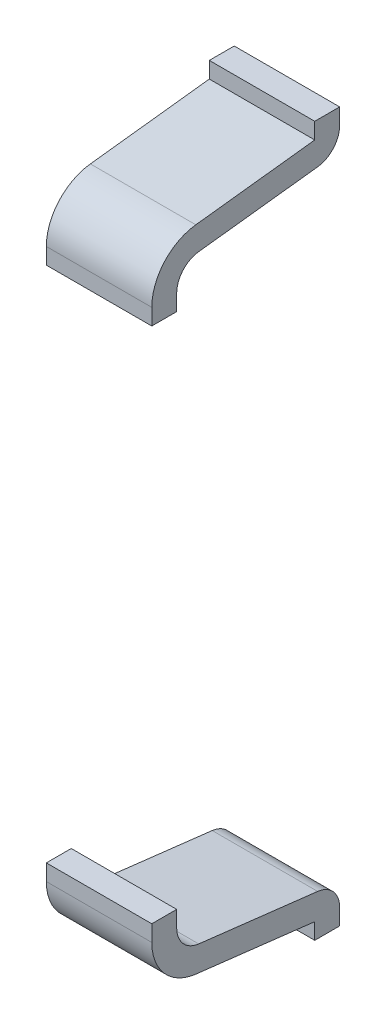
ISO-10303-21;
HEADER;
FILE_DESCRIPTION(('STEP AP214'),'2;1');
FILE_NAME('part.step','',(''),(''),'','','');
FILE_SCHEMA(('AUTOMOTIVE_DESIGN { 1 0 10303 214 1 1 1 1 }'));
ENDSEC;
DATA;
#1=APPLICATION_CONTEXT('core data for automotive mechanical design processes');
#2=APPLICATION_PROTOCOL_DEFINITION('international standard','automotive_design',2000,#1);
#3=PRODUCT_CONTEXT('',#1,'mechanical');
#4=PRODUCT('Part','Part','',(#3));
#5=PRODUCT_RELATED_PRODUCT_CATEGORY('part','',(#4));
#6=PRODUCT_DEFINITION_FORMATION('','',#4);
#7=PRODUCT_DEFINITION_CONTEXT('part definition',#1,'design');
#8=PRODUCT_DEFINITION('design','',#6,#7);
#9=PRODUCT_DEFINITION_SHAPE('','',#8);
#10=(LENGTH_UNIT() NAMED_UNIT(*) SI_UNIT(.MILLI.,.METRE.));
#11=(NAMED_UNIT(*) PLANE_ANGLE_UNIT() SI_UNIT($,.RADIAN.));
#12=(NAMED_UNIT(*) SI_UNIT($,.STERADIAN.) SOLID_ANGLE_UNIT());
#13=UNCERTAINTY_MEASURE_WITH_UNIT(LENGTH_MEASURE(1.E-05),#10,'distance_accuracy_value','');
#14=(GEOMETRIC_REPRESENTATION_CONTEXT(3) GLOBAL_UNCERTAINTY_ASSIGNED_CONTEXT((#13)) GLOBAL_UNIT_ASSIGNED_CONTEXT((#10,
#11,#12)) REPRESENTATION_CONTEXT('',''));
#15=CARTESIAN_POINT('',(0.,0.,0.));
#16=DIRECTION('',(0.,0.,1.));
#17=DIRECTION('',(1.,0.,0.));
#18=AXIS2_PLACEMENT_3D('',#15,#16,#17);
#19=CARTESIAN_POINT('',(22.475012124208,21.284404650835,0.));
#20=DIRECTION('',(0.,0.,1.));
#21=DIRECTION('',(1.,0.,0.));
#22=AXIS2_PLACEMENT_3D('',#19,#20,#21);
#23=PLANE('',#22);
#24=DIRECTION('',(4.371138822551E-08,-0.999999999999999,0.));
#25=VECTOR('',#24,1.);
#26=CARTESIAN_POINT('',(22.475012106042,21.700007095536,0.));
#27=LINE('',#26,#25);
#28=CARTESIAN_POINT('',(22.4750121242086,21.2844046508348,0.));
#29=VERTEX_POINT('',#28);
#30=CARTESIAN_POINT('',(22.4750121278977,21.2000070955362,0.));
#31=VERTEX_POINT('',#30);
#32=EDGE_CURVE('P0_E168',#29,#31,#27,.T.);
#33=ORIENTED_EDGE('',*,*,#32,.T.);
#34=DIRECTION('',(-0.999999999999999,-4.371138828674E-08,0.));
#35=VECTOR('',#34,1.);
#36=CARTESIAN_POINT('',(22.200012127897,21.200007083516,0.));
#37=LINE('',#36,#35);
#38=CARTESIAN_POINT('',(21.9250121278975,21.2000070714951,0.));
#39=VERTEX_POINT('',#38);
#40=EDGE_CURVE('P0_E104',#31,#39,#37,.T.);
#41=ORIENTED_EDGE('',*,*,#40,.T.);
#42=DIRECTION('',(-4.371138822551E-08,0.999999999999999,0.));
#43=VECTOR('',#42,1.);
#44=CARTESIAN_POINT('',(21.925012106042,21.700007071495,0.));
#45=LINE('',#44,#43);
#46=CARTESIAN_POINT('',(21.9250121242083,21.2844046267936,0.));
#47=VERTEX_POINT('',#46);
#48=EDGE_CURVE('P0_E185',#39,#47,#45,.T.);
#49=ORIENTED_EDGE('',*,*,#48,.T.);
#50=DIRECTION('',(-0.999999999999999,-4.371138822551E-08,0.));
#51=VECTOR('',#50,1.);
#52=CARTESIAN_POINT('',(22.200012124208,21.2844046388144,0.));
#53=LINE('',#52,#51);
#54=EDGE_CURVE('P0_E174',#29,#47,#53,.T.);
#55=ORIENTED_EDGE('',*,*,#54,.F.);
#56=EDGE_LOOP('',(#33,#41,#49,#55));
#57=FACE_BOUND('',#56,.T.);
#58=ADVANCED_FACE('P0_F17',(#57),#23,.F.);
#59=CARTESIAN_POINT('',(22.200012127897,21.200007083516,0.065));
#60=DIRECTION('',(-4.371138828674E-08,0.999999999999999,0.));
#61=DIRECTION('',(-0.999999999999999,-4.371138828674E-08,0.));
#62=AXIS2_PLACEMENT_3D('',#59,#60,#61);
#63=PLANE('',#62);
#64=DIRECTION('',(-1.,0.,0.));
#65=VECTOR('',#64,1.);
#66=CARTESIAN_POINT('',(21.925012124208,21.200007095536,0.13));
#67=LINE('',#66,#65);
#68=CARTESIAN_POINT('',(22.4750121278977,21.200007095536,0.13));
#69=VERTEX_POINT('',#68);
#70=CARTESIAN_POINT('',(21.9250121278975,21.2000070795087,0.13));
#71=VERTEX_POINT('',#70);
#72=EDGE_CURVE('P0_E153',#69,#71,#67,.T.);
#73=ORIENTED_EDGE('',*,*,#72,.T.);
#74=DIRECTION('',(0.,0.,1.));
#75=VECTOR('',#74,1.);
#76=CARTESIAN_POINT('',(21.9250121278977,21.200007071495,0.85));
#77=LINE('',#76,#75);
#78=EDGE_CURVE('P0_E182',#71,#39,#77,.F.);
#79=ORIENTED_EDGE('',*,*,#78,.T.);
#80=ORIENTED_EDGE('',*,*,#40,.F.);
#81=DIRECTION('',(0.,0.,1.));
#82=VECTOR('',#81,1.);
#83=CARTESIAN_POINT('',(22.4750121278977,21.200007095536,0.98));
#84=LINE('',#83,#82);
#85=EDGE_CURVE('P0_E160',#31,#69,#84,.T.);
#86=ORIENTED_EDGE('',*,*,#85,.T.);
#87=EDGE_LOOP('',(#73,#79,#80,#86));
#88=FACE_BOUND('',#87,.T.);
#89=ADVANCED_FACE('P0_F251',(#88),#63,.F.);
#90=CARTESIAN_POINT('',(21.925012124208,21.284404626794,0.13));
#91=DIRECTION('',(0.,0.,-1.));
#92=DIRECTION('',(-1.,0.,0.));
#93=AXIS2_PLACEMENT_3D('',#90,#91,#92);
#94=PLANE('',#93);
#95=DIRECTION('',(-4.371138822551E-08,0.999999999999999,0.));
#96=VECTOR('',#95,1.);
#97=CARTESIAN_POINT('',(21.925012106042,21.700007071495,0.13));
#98=LINE('',#97,#96);
#99=CARTESIAN_POINT('',(21.9250121242084,21.2844046269033,0.130000000929926));
#100=VERTEX_POINT('',#99);
#101=EDGE_CURVE('P0_E186',#100,#71,#98,.F.);
#102=ORIENTED_EDGE('',*,*,#101,.T.);
#103=ORIENTED_EDGE('',*,*,#72,.F.);
#104=DIRECTION('',(4.371138822551E-08,-0.999999999999999,0.));
#105=VECTOR('',#104,1.);
#106=CARTESIAN_POINT('',(22.475012106042,21.700007095536,0.13));
#107=LINE('',#106,#105);
#108=CARTESIAN_POINT('',(22.4750121242086,21.284404650835,0.130000000000002));
#109=VERTEX_POINT('',#108);
#110=EDGE_CURVE('P0_E156',#69,#109,#107,.F.);
#111=ORIENTED_EDGE('',*,*,#110,.T.);
#112=DIRECTION('',(0.999999999999999,4.31146457241295E-08,-5.07231126164442E-09));
#113=VECTOR('',#112,1.);
#114=CARTESIAN_POINT('',(21.925012121018,21.2844046271219,0.130000002789779));
#115=LINE('',#114,#113);
#116=EDGE_CURVE('P0_E151',#109,#100,#115,.F.);
#117=ORIENTED_EDGE('',*,*,#116,.T.);
#118=EDGE_LOOP('',(#102,#103,#111,#117));
#119=FACE_BOUND('',#118,.T.);
#120=ADVANCED_FACE('P0_F253',(#119),#94,.F.);
#121=CARTESIAN_POINT('',(21.925012121018,21.357390359072,0.750378724368));
#122=DIRECTION('',(-4.34119916319467E-08,0.993150604322923,-0.116841247566991));
#123=DIRECTION('',(0.,0.116841247566991,0.993150604322924));
#124=AXIS2_PLACEMENT_3D('',#121,#122,#123);
#125=PLANE('',#124);
#126=DIRECTION('',(5.10728989937901E-09,-0.116841247566462,-0.993150604322986));
#127=VECTOR('',#126,1.);
#128=CARTESIAN_POINT('',(21.9250121210183,21.357390359072,0.750378724368));
#129=LINE('',#128,#127);
#130=CARTESIAN_POINT('',(21.9250121210181,21.3573903590722,0.75037872436764));
#131=VERTEX_POINT('',#130);
#132=EDGE_CURVE('P0_E191',#131,#100,#129,.T.);
#133=ORIENTED_EDGE('',*,*,#132,.T.);
#134=ORIENTED_EDGE('',*,*,#116,.F.);
#135=DIRECTION('',(-5.10728989937805E-09,0.116841247568051,0.993150604322799));
#136=VECTOR('',#135,1.);
#137=CARTESIAN_POINT('',(22.4750121242086,21.284404650835,0.13));
#138=LINE('',#137,#136);
#139=CARTESIAN_POINT('',(22.4750121210181,21.3573903831139,0.750378724367796));
#140=VERTEX_POINT('',#139);
#141=EDGE_CURVE('P0_E159',#109,#140,#138,.T.);
#142=ORIENTED_EDGE('',*,*,#141,.T.);
#143=DIRECTION('',(0.999999999999999,4.371138822551E-08,0.));
#144=VECTOR('',#143,1.);
#145=CARTESIAN_POINT('',(22.2000121210181,21.3573903710931,0.750378724367945));
#146=LINE('',#145,#144);
#147=EDGE_CURVE('P0_E149',#131,#140,#146,.T.);
#148=ORIENTED_EDGE('',*,*,#147,.F.);
#149=EDGE_LOOP('',(#133,#134,#142,#148));
#150=FACE_BOUND('',#149,.T.);
#151=ADVANCED_FACE('P0_F234',(#150),#125,.F.);
#152=CARTESIAN_POINT('',(22.200012109731,21.615609528217,0.72));
#153=DIRECTION('',(0.999999999999999,4.371138822551E-08,0.));
#154=DIRECTION('',(-4.371138822551E-08,0.999999999999999,0.));
#155=AXIS2_PLACEMENT_3D('',#152,#153,#154);
#156=CYLINDRICAL_SURFACE('',#155,0.26);
#157=ORIENTED_EDGE('',*,*,#147,.T.);
#158=CARTESIAN_POINT('',(22.4750121097309,21.6156095402376,0.72));
#159=DIRECTION('',(0.999999999999999,4.371138822551E-08,0.));
#160=DIRECTION('',(-4.371138822551E-08,0.999999999999999,0.));
#161=AXIS2_PLACEMENT_3D('',#158,#159,#160);
#162=CIRCLE('',#161,0.26);
#163=CARTESIAN_POINT('',(22.475012109731,21.6156095402373,0.98));
#164=VERTEX_POINT('',#163);
#165=EDGE_CURVE('P0_E139',#140,#164,#162,.F.);
#166=ORIENTED_EDGE('',*,*,#165,.T.);
#167=DIRECTION('',(-1.,0.,0.));
#168=VECTOR('',#167,1.);
#169=CARTESIAN_POINT('',(21.925012106042,21.615609540237,0.98));
#170=LINE('',#169,#168);
#171=CARTESIAN_POINT('',(21.9250121097311,21.6156095282167,0.98));
#172=VERTEX_POINT('',#171);
#173=EDGE_CURVE('P0_E75',#164,#172,#170,.T.);
#174=ORIENTED_EDGE('',*,*,#173,.T.);
#175=CARTESIAN_POINT('',(21.925012109731,21.6156095161964,0.72));
#176=DIRECTION('',(0.999999999999999,4.371138822551E-08,0.));
#177=DIRECTION('',(-4.371138822551E-08,0.999999999999999,0.));
#178=AXIS2_PLACEMENT_3D('',#175,#176,#177);
#179=CIRCLE('',#178,0.26);
#180=EDGE_CURVE('P0_E20',#172,#131,#179,.T.);
#181=ORIENTED_EDGE('',*,*,#180,.T.);
#182=EDGE_LOOP('',(#157,#166,#174,#181));
#183=FACE_BOUND('',#182,.T.);
#184=ADVANCED_FACE('P0_F228',(#183),#156,.T.);
#185=CARTESIAN_POINT('',(21.925012106042,21.700007071495,0.98));
#186=DIRECTION('',(0.,0.,-1.));
#187=DIRECTION('',(-1.,0.,0.));
#188=AXIS2_PLACEMENT_3D('',#185,#186,#187);
#189=PLANE('',#188);
#190=DIRECTION('',(-4.371138822551E-08,0.999999999999999,0.));
#191=VECTOR('',#190,1.);
#192=CARTESIAN_POINT('',(21.925012106042,21.700007071495,0.98));
#193=LINE('',#192,#191);
#194=CARTESIAN_POINT('',(21.925012106042,21.7000070714951,0.98));
#195=VERTEX_POINT('',#194);
#196=EDGE_CURVE('P0_E84',#195,#172,#193,.F.);
#197=ORIENTED_EDGE('',*,*,#196,.T.);
#198=ORIENTED_EDGE('',*,*,#173,.F.);
#199=DIRECTION('',(4.371138822551E-08,-0.999999999999999,0.));
#200=VECTOR('',#199,1.);
#201=CARTESIAN_POINT('',(22.475012106042,21.700007095536,0.98));
#202=LINE('',#201,#200);
#203=CARTESIAN_POINT('',(22.475012106042,21.7000070955362,0.98));
#204=VERTEX_POINT('',#203);
#205=EDGE_CURVE('P0_E135',#164,#204,#202,.F.);
#206=ORIENTED_EDGE('',*,*,#205,.T.);
#207=DIRECTION('',(-0.999999999999999,-4.371138828674E-08,0.));
#208=VECTOR('',#207,1.);
#209=CARTESIAN_POINT('',(22.200012106042,21.700007083516,0.98));
#210=LINE('',#209,#208);
#211=EDGE_CURVE('P0_E120',#195,#204,#210,.F.);
#212=ORIENTED_EDGE('',*,*,#211,.F.);
#213=EDGE_LOOP('',(#197,#198,#206,#212));
#214=FACE_BOUND('',#213,.T.);
#215=ADVANCED_FACE('P0_F280',(#214),#189,.F.);
#216=CARTESIAN_POINT('',(22.200012106042,21.700007083516,0.915));
#217=DIRECTION('',(-4.371138828674E-08,0.999999999999999,0.));
#218=DIRECTION('',(-0.999999999999999,-4.371138828674E-08,0.));
#219=AXIS2_PLACEMENT_3D('',#216,#217,#218);
#220=PLANE('',#219);
#221=DIRECTION('',(0.,0.,1.));
#222=VECTOR('',#221,1.);
#223=CARTESIAN_POINT('',(21.925012106042,21.700007071495,0.85));
#224=LINE('',#223,#222);
#225=CARTESIAN_POINT('',(21.925012106042,21.7000070795087,0.85));
#226=VERTEX_POINT('',#225);
#227=EDGE_CURVE('P0_E175',#226,#195,#224,.T.);
#228=ORIENTED_EDGE('',*,*,#227,.T.);
#229=ORIENTED_EDGE('',*,*,#211,.T.);
#230=DIRECTION('',(0.,0.,1.));
#231=VECTOR('',#230,1.);
#232=CARTESIAN_POINT('',(22.475012106042,21.700007095536,0.98));
#233=LINE('',#232,#231);
#234=CARTESIAN_POINT('',(22.475012106042,21.700007095536,0.85));
#235=VERTEX_POINT('',#234);
#236=EDGE_CURVE('P0_E126',#204,#235,#233,.F.);
#237=ORIENTED_EDGE('',*,*,#236,.T.);
#238=DIRECTION('',(1.,0.,0.));
#239=VECTOR('',#238,1.);
#240=CARTESIAN_POINT('',(22.475012106042,21.700007095536,0.85));
#241=LINE('',#240,#239);
#242=EDGE_CURVE('P0_E112',#235,#226,#241,.F.);
#243=ORIENTED_EDGE('',*,*,#242,.T.);
#244=EDGE_LOOP('',(#228,#229,#237,#243));
#245=FACE_BOUND('',#244,.T.);
#246=ADVANCED_FACE('P0_F133',(#245),#220,.T.);
#247=CARTESIAN_POINT('',(22.475012106042,21.700007095536,0.85));
#248=DIRECTION('',(0.,0.,1.));
#249=DIRECTION('',(1.,0.,0.));
#250=AXIS2_PLACEMENT_3D('',#247,#248,#249);
#251=PLANE('',#250);
#252=DIRECTION('',(4.371138822551E-08,-0.999999999999999,0.));
#253=VECTOR('',#252,1.);
#254=CARTESIAN_POINT('',(22.475012106042,21.700007095536,0.85));
#255=LINE('',#254,#253);
#256=CARTESIAN_POINT('',(22.4750121097308,21.6156095402373,0.85));
#257=VERTEX_POINT('',#256);
#258=EDGE_CURVE('P0_E118',#235,#257,#255,.T.);
#259=ORIENTED_EDGE('',*,*,#258,.T.);
#260=DIRECTION('',(0.999999999999999,4.371138822551E-08,0.));
#261=VECTOR('',#260,1.);
#262=CARTESIAN_POINT('',(22.200012109731,21.6156095282164,0.85));
#263=LINE('',#262,#261);
#264=CARTESIAN_POINT('',(21.9250121097311,21.6156095161961,0.85));
#265=VERTEX_POINT('',#264);
#266=EDGE_CURVE('P0_E194',#257,#265,#263,.F.);
#267=ORIENTED_EDGE('',*,*,#266,.T.);
#268=DIRECTION('',(-4.371138822551E-08,0.999999999999999,0.));
#269=VECTOR('',#268,1.);
#270=CARTESIAN_POINT('',(21.925012106042,21.700007071495,0.85));
#271=LINE('',#270,#269);
#272=EDGE_CURVE('P0_E119',#265,#226,#271,.T.);
#273=ORIENTED_EDGE('',*,*,#272,.T.);
#274=ORIENTED_EDGE('',*,*,#242,.F.);
#275=EDGE_LOOP('',(#259,#267,#273,#274));
#276=FACE_BOUND('',#275,.T.);
#277=ADVANCED_FACE('P0_F116',(#276),#251,.F.);
#278=CARTESIAN_POINT('',(21.925012106042,21.700007071495,0.85));
#279=DIRECTION('',(0.999999999999999,4.371138822551E-08,0.));
#280=DIRECTION('',(-4.371138822551E-08,0.999999999999999,0.));
#281=AXIS2_PLACEMENT_3D('',#278,#279,#280);
#282=PLANE('',#281);
#283=ORIENTED_EDGE('',*,*,#272,.F.);
#284=CARTESIAN_POINT('',(21.925012109731,21.6156095161964,0.72));
#285=DIRECTION('',(0.999999999999999,4.371138822551E-08,0.));
#286=DIRECTION('',(-4.371138822551E-08,0.999999999999999,0.));
#287=AXIS2_PLACEMENT_3D('',#284,#285,#286);
#288=CIRCLE('',#287,0.13);
#289=CARTESIAN_POINT('',(21.9250121153743,21.4864999378807,0.735189364276325));
#290=VERTEX_POINT('',#289);
#291=EDGE_CURVE('P0_E134',#265,#290,#288,.T.);
#292=ORIENTED_EDGE('',*,*,#291,.T.);
#293=DIRECTION('',(0.,-0.116841247566991,-0.993150604322924));
#294=VECTOR('',#293,1.);
#295=CARTESIAN_POINT('',(21.925012115374,21.4864999379629,0.735189364973771));
#296=LINE('',#295,#294);
#297=CARTESIAN_POINT('',(21.9250121169692,21.4135142053559,0.114810637816016));
#298=VERTEX_POINT('',#297);
#299=EDGE_CURVE('P0_E208',#290,#298,#296,.T.);
#300=ORIENTED_EDGE('',*,*,#299,.T.);
#301=CARTESIAN_POINT('',(21.925012124208,21.2844046267934,0.13));
#302=DIRECTION('',(-0.999999999999999,-4.371138822551E-08,0.));
#303=DIRECTION('',(4.371138822551E-08,-0.999999999999999,0.));
#304=AXIS2_PLACEMENT_3D('',#301,#302,#303);
#305=CIRCLE('',#304,0.13);
#306=EDGE_CURVE('P0_E130',#47,#298,#305,.F.);
#307=ORIENTED_EDGE('',*,*,#306,.F.);
#308=ORIENTED_EDGE('',*,*,#48,.F.);
#309=ORIENTED_EDGE('',*,*,#78,.F.);
#310=ORIENTED_EDGE('',*,*,#101,.F.);
#311=ORIENTED_EDGE('',*,*,#132,.F.);
#312=ORIENTED_EDGE('',*,*,#180,.F.);
#313=ORIENTED_EDGE('',*,*,#196,.F.);
#314=ORIENTED_EDGE('',*,*,#227,.F.);
#315=EDGE_LOOP('',(#283,#292,#300,#307,#308,#309,#310,#311,#312,#313,#314));
#316=FACE_BOUND('',#315,.T.);
#317=ADVANCED_FACE('P0_F210',(#316),#282,.F.);
#318=CARTESIAN_POINT('',(22.200012124208,21.284404638814,0.13));
#319=DIRECTION('',(-0.999999999999999,-4.371138822551E-08,0.));
#320=DIRECTION('',(4.371138822551E-08,-0.999999999999999,0.));
#321=AXIS2_PLACEMENT_3D('',#318,#319,#320);
#322=CYLINDRICAL_SURFACE('',#321,0.13);
#323=ORIENTED_EDGE('',*,*,#54,.T.);
#324=ORIENTED_EDGE('',*,*,#306,.T.);
#325=DIRECTION('',(0.999999999999999,4.31146457241295E-08,-5.07231126164442E-09));
#326=VECTOR('',#325,1.);
#327=CARTESIAN_POINT('',(22.475012115374,21.4135142290695,0.114810635026182));
#328=LINE('',#327,#326);
#329=CARTESIAN_POINT('',(22.475012118565,21.4135142292336,0.114810636421174));
#330=VERTEX_POINT('',#329);
#331=EDGE_CURVE('P0_E203',#298,#330,#328,.T.);
#332=ORIENTED_EDGE('',*,*,#331,.T.);
#333=CARTESIAN_POINT('',(22.4750121242086,21.2844046508346,0.13));
#334=DIRECTION('',(-0.999999999999999,-4.371138822551E-08,0.));
#335=DIRECTION('',(4.371138822551E-08,-0.999999999999999,0.));
#336=AXIS2_PLACEMENT_3D('',#333,#334,#335);
#337=CIRCLE('',#336,0.13);
#338=EDGE_CURVE('P0_E129',#330,#29,#337,.T.);
#339=ORIENTED_EDGE('',*,*,#338,.T.);
#340=EDGE_LOOP('',(#323,#324,#332,#339));
#341=FACE_BOUND('',#340,.T.);
#342=ADVANCED_FACE('P0_F202',(#341),#322,.T.);
#343=CARTESIAN_POINT('',(22.475012106042,21.700007095536,0.98));
#344=DIRECTION('',(-0.999999999999999,-4.371138822551E-08,0.));
#345=DIRECTION('',(4.371138822551E-08,-0.999999999999999,0.));
#346=AXIS2_PLACEMENT_3D('',#343,#344,#345);
#347=PLANE('',#346);
#348=ORIENTED_EDGE('',*,*,#205,.F.);
#349=ORIENTED_EDGE('',*,*,#165,.F.);
#350=ORIENTED_EDGE('',*,*,#141,.F.);
#351=ORIENTED_EDGE('',*,*,#110,.F.);
#352=ORIENTED_EDGE('',*,*,#85,.F.);
#353=ORIENTED_EDGE('',*,*,#32,.F.);
#354=ORIENTED_EDGE('',*,*,#338,.F.);
#355=DIRECTION('',(0.,-0.116841247566991,-0.993150604322924));
#356=VECTOR('',#355,1.);
#357=CARTESIAN_POINT('',(22.475012118565,21.486499961676,0.735189362184));
#358=LINE('',#357,#356);
#359=CARTESIAN_POINT('',(22.4750121169695,21.486499961676,0.735189362183836));
#360=VERTEX_POINT('',#359);
#361=EDGE_CURVE('P0_E26',#330,#360,#358,.F.);
#362=ORIENTED_EDGE('',*,*,#361,.T.);
#363=CARTESIAN_POINT('',(22.4750121097304,21.6156095402376,0.72));
#364=DIRECTION('',(0.999999999999999,4.371138822551E-08,0.));
#365=DIRECTION('',(-4.371138822551E-08,0.999999999999999,0.));
#366=AXIS2_PLACEMENT_3D('',#363,#364,#365);
#367=CIRCLE('',#366,0.13);
#368=EDGE_CURVE('P0_E34',#360,#257,#367,.F.);
#369=ORIENTED_EDGE('',*,*,#368,.T.);
#370=ORIENTED_EDGE('',*,*,#258,.F.);
#371=ORIENTED_EDGE('',*,*,#236,.F.);
#372=EDGE_LOOP('',(#348,#349,#350,#351,#352,#353,#354,#362,#369,#370,#371));
#373=FACE_BOUND('',#372,.T.);
#374=ADVANCED_FACE('P0_F125',(#373),#347,.F.);
#375=CARTESIAN_POINT('',(22.200012109731,21.615609528217,0.72));
#376=DIRECTION('',(0.999999999999999,4.371138822551E-08,0.));
#377=DIRECTION('',(-4.371138822551E-08,0.999999999999999,0.));
#378=AXIS2_PLACEMENT_3D('',#375,#376,#377);
#379=CYLINDRICAL_SURFACE('',#378,0.13);
#380=ORIENTED_EDGE('',*,*,#368,.F.);
#381=DIRECTION('',(0.999999999999999,4.31146457241295E-08,-5.07231126164442E-09));
#382=VECTOR('',#381,1.);
#383=CARTESIAN_POINT('',(22.475012115374,21.486499961676,0.735189362184));
#384=LINE('',#383,#382);
#385=EDGE_CURVE('P0_E11',#360,#290,#384,.F.);
#386=ORIENTED_EDGE('',*,*,#385,.T.);
#387=ORIENTED_EDGE('',*,*,#291,.F.);
#388=ORIENTED_EDGE('',*,*,#266,.F.);
#389=EDGE_LOOP('',(#380,#386,#387,#388));
#390=FACE_BOUND('',#389,.T.);
#391=ADVANCED_FACE('P0_F263',(#390),#379,.F.);
#392=CARTESIAN_POINT('',(22.475012115374,21.486499961676,0.735189362184));
#393=DIRECTION('',(4.34119916319467E-08,-0.993150604322923,0.116841247566991));
#394=DIRECTION('',(0.,-0.116841247566991,-0.993150604322924));
#395=AXIS2_PLACEMENT_3D('',#392,#393,#394);
#396=PLANE('',#395);
#397=ORIENTED_EDGE('',*,*,#361,.F.);
#398=ORIENTED_EDGE('',*,*,#331,.F.);
#399=ORIENTED_EDGE('',*,*,#299,.F.);
#400=ORIENTED_EDGE('',*,*,#385,.F.);
#401=EDGE_LOOP('',(#397,#398,#399,#400));
#402=FACE_BOUND('',#401,.T.);
#403=ADVANCED_FACE('P0_F207',(#402),#396,.F.);
#404=CLOSED_SHELL('',(#58,#89,#120,#151,#184,#215,#246,#277,#317,#342,#374,#391,#403));
#405=MANIFOLD_SOLID_BREP('P0_B1',#404);
#406=CARTESIAN_POINT('',(22.200011988021,24.400007083516,0.915));
#407=DIRECTION('',(-4.371138828674E-08,0.999999999999999,0.));
#408=DIRECTION('',(-0.999999999999999,-4.371138828674E-08,0.));
#409=AXIS2_PLACEMENT_3D('',#406,#407,#408);
#410=PLANE('',#409);
#411=DIRECTION('',(1.,0.,0.));
#412=VECTOR('',#411,1.);
#413=CARTESIAN_POINT('',(21.925011988021,24.400007071495,0.98));
#414=LINE('',#413,#412);
#415=CARTESIAN_POINT('',(21.925011988021,24.400007071495,0.98));
#416=VERTEX_POINT('',#415);
#417=CARTESIAN_POINT('',(22.475011988021,24.4000070875223,0.98));
#418=VERTEX_POINT('',#417);
#419=EDGE_CURVE('P1_E152',#416,#418,#414,.T.);
#420=ORIENTED_EDGE('',*,*,#419,.F.);
#421=DIRECTION('',(0.,0.,1.));
#422=VECTOR('',#421,1.);
#423=CARTESIAN_POINT('',(21.925011988021,24.400007071495,0.85));
#424=LINE('',#423,#422);
#425=CARTESIAN_POINT('',(21.925011988021,24.4000070795087,0.85));
#426=VERTEX_POINT('',#425);
#427=EDGE_CURVE('P1_E140',#426,#416,#424,.T.);
#428=ORIENTED_EDGE('',*,*,#427,.F.);
#429=DIRECTION('',(-1.,0.,0.));
#430=VECTOR('',#429,1.);
#431=CARTESIAN_POINT('',(22.475011988021,24.400007095536,0.85));
#432=LINE('',#431,#430);
#433=CARTESIAN_POINT('',(22.4750119867913,24.400007095536,0.85));
#434=VERTEX_POINT('',#433);
#435=EDGE_CURVE('P1_E112',#434,#426,#432,.T.);
#436=ORIENTED_EDGE('',*,*,#435,.F.);
#437=DIRECTION('',(0.,0.,1.));
#438=VECTOR('',#437,1.);
#439=CARTESIAN_POINT('',(22.475011988021,24.400007095536,0.98));
#440=LINE('',#439,#438);
#441=EDGE_CURVE('P1_E127',#418,#434,#440,.F.);
#442=ORIENTED_EDGE('',*,*,#441,.F.);
#443=EDGE_LOOP('',(#420,#428,#436,#442));
#444=FACE_BOUND('',#443,.T.);
#445=ADVANCED_FACE('P1_F17',(#444),#410,.F.);
#446=CARTESIAN_POINT('',(21.925011988021,24.400007071495,0.98));
#447=DIRECTION('',(0.,0.,1.));
#448=DIRECTION('',(1.,0.,0.));
#449=AXIS2_PLACEMENT_3D('',#446,#447,#448);
#450=PLANE('',#449);
#451=DIRECTION('',(-0.999999999999999,-4.371138834797E-08,0.));
#452=VECTOR('',#451,1.);
#453=CARTESIAN_POINT('',(22.200011984332,24.4844046388146,0.98));
#454=LINE('',#453,#452);
#455=CARTESIAN_POINT('',(21.925011984332,24.4844046267937,0.98));
#456=VERTEX_POINT('',#455);
#457=CARTESIAN_POINT('',(22.4750119843319,24.4844046508349,0.98));
#458=VERTEX_POINT('',#457);
#459=EDGE_CURVE('P1_E129',#456,#458,#454,.F.);
#460=ORIENTED_EDGE('',*,*,#459,.F.);
#461=DIRECTION('',(4.371138834797E-08,-0.999999999999999,0.));
#462=VECTOR('',#461,1.);
#463=CARTESIAN_POINT('',(21.925011988021,24.400007071495,0.98));
#464=LINE('',#463,#462);
#465=EDGE_CURVE('P1_E143',#416,#456,#464,.F.);
#466=ORIENTED_EDGE('',*,*,#465,.F.);
#467=ORIENTED_EDGE('',*,*,#419,.T.);
#468=DIRECTION('',(-4.371138834797E-08,0.999999999999999,0.));
#469=VECTOR('',#468,1.);
#470=CARTESIAN_POINT('',(22.475011988021,24.400007095536,0.98));
#471=LINE('',#470,#469);
#472=EDGE_CURVE('P1_E187',#458,#418,#471,.F.);
#473=ORIENTED_EDGE('',*,*,#472,.F.);
#474=EDGE_LOOP('',(#460,#466,#467,#473));
#475=FACE_BOUND('',#474,.T.);
#476=ADVANCED_FACE('P1_F237',(#475),#450,.T.);
#477=CARTESIAN_POINT('',(22.200011966165,24.900007083516,0.065));
#478=DIRECTION('',(-4.371138828674E-08,0.999999999999999,0.));
#479=DIRECTION('',(-0.999999999999999,-4.371138828674E-08,0.));
#480=AXIS2_PLACEMENT_3D('',#477,#478,#479);
#481=PLANE('',#480);
#482=DIRECTION('',(0.,0.,1.));
#483=VECTOR('',#482,1.);
#484=CARTESIAN_POINT('',(21.9250119661653,24.900007071495,0.85));
#485=LINE('',#484,#483);
#486=CARTESIAN_POINT('',(21.9250119661652,24.9000070795087,0.13));
#487=VERTEX_POINT('',#486);
#488=CARTESIAN_POINT('',(21.9250119661653,24.900007071495,0.));
#489=VERTEX_POINT('',#488);
#490=EDGE_CURVE('P1_E155',#487,#489,#485,.F.);
#491=ORIENTED_EDGE('',*,*,#490,.F.);
#492=DIRECTION('',(1.,0.,0.));
#493=VECTOR('',#492,1.);
#494=CARTESIAN_POINT('',(21.925011969854,24.900007095536,0.13));
#495=LINE('',#494,#493);
#496=CARTESIAN_POINT('',(22.4750119686244,24.900007095536,0.13));
#497=VERTEX_POINT('',#496);
#498=EDGE_CURVE('P1_E144',#497,#487,#495,.F.);
#499=ORIENTED_EDGE('',*,*,#498,.F.);
#500=DIRECTION('',(0.,0.,1.));
#501=VECTOR('',#500,1.);
#502=CARTESIAN_POINT('',(22.4750119661653,24.900007095536,0.98));
#503=LINE('',#502,#501);
#504=CARTESIAN_POINT('',(22.4750119661652,24.9000070875223,0.));
#505=VERTEX_POINT('',#504);
#506=EDGE_CURVE('P1_E170',#505,#497,#503,.T.);
#507=ORIENTED_EDGE('',*,*,#506,.F.);
#508=DIRECTION('',(-1.,0.,0.));
#509=VECTOR('',#508,1.);
#510=CARTESIAN_POINT('',(22.475011969854,24.900007071495,0.));
#511=LINE('',#510,#509);
#512=EDGE_CURVE('P1_E150',#489,#505,#511,.F.);
#513=ORIENTED_EDGE('',*,*,#512,.F.);
#514=EDGE_LOOP('',(#491,#499,#507,#513));
#515=FACE_BOUND('',#514,.T.);
#516=ADVANCED_FACE('P1_F248',(#515),#481,.T.);
#517=CARTESIAN_POINT('',(22.475011969854,24.815609540237,0.));
#518=DIRECTION('',(0.,0.,-1.));
#519=DIRECTION('',(-1.,0.,0.));
#520=AXIS2_PLACEMENT_3D('',#517,#518,#519);
#521=PLANE('',#520);
#522=ORIENTED_EDGE('',*,*,#512,.T.);
#523=DIRECTION('',(-4.371138834797E-08,0.999999999999999,0.));
#524=VECTOR('',#523,1.);
#525=CARTESIAN_POINT('',(22.475011988021,24.400007095536,0.));
#526=LINE('',#525,#524);
#527=CARTESIAN_POINT('',(22.4750119698542,24.8156095402374,0.));
#528=VERTEX_POINT('',#527);
#529=EDGE_CURVE('P1_E173',#528,#505,#526,.T.);
#530=ORIENTED_EDGE('',*,*,#529,.F.);
#531=DIRECTION('',(0.999999999999999,4.371138834797E-08,0.));
#532=VECTOR('',#531,1.);
#533=CARTESIAN_POINT('',(22.200011969854,24.8156095282166,0.));
#534=LINE('',#533,#532);
#535=CARTESIAN_POINT('',(21.9250119698544,24.8156095161962,0.));
#536=VERTEX_POINT('',#535);
#537=EDGE_CURVE('P1_E148',#536,#528,#534,.T.);
#538=ORIENTED_EDGE('',*,*,#537,.F.);
#539=DIRECTION('',(4.371138834797E-08,-0.999999999999999,0.));
#540=VECTOR('',#539,1.);
#541=CARTESIAN_POINT('',(21.925011988021,24.400007071495,0.));
#542=LINE('',#541,#540);
#543=EDGE_CURVE('P1_E158',#489,#536,#542,.T.);
#544=ORIENTED_EDGE('',*,*,#543,.F.);
#545=EDGE_LOOP('',(#522,#530,#538,#544));
#546=FACE_BOUND('',#545,.T.);
#547=ADVANCED_FACE('P1_F252',(#546),#521,.T.);
#548=CARTESIAN_POINT('',(22.200011969854,24.815609528217,0.13));
#549=DIRECTION('',(0.999999999999999,4.371138834797E-08,0.));
#550=DIRECTION('',(-4.371138834797E-08,0.999999999999999,0.));
#551=AXIS2_PLACEMENT_3D('',#548,#549,#550);
#552=CYLINDRICAL_SURFACE('',#551,0.13);
#553=ORIENTED_EDGE('',*,*,#537,.T.);
#554=CARTESIAN_POINT('',(22.475011969854,24.8156095402376,0.13));
#555=DIRECTION('',(0.999999999999999,4.371138834797E-08,0.));
#556=DIRECTION('',(-4.371138834797E-08,0.999999999999999,0.));
#557=AXIS2_PLACEMENT_3D('',#554,#555,#556);
#558=CIRCLE('',#557,0.13);
#559=CARTESIAN_POINT('',(22.4750119754976,24.6864999615116,0.114810639210985));
#560=VERTEX_POINT('',#559);
#561=EDGE_CURVE('P1_E121',#560,#528,#558,.T.);
#562=ORIENTED_EDGE('',*,*,#561,.F.);
#563=DIRECTION('',(0.999999999999999,4.31146458449265E-08,5.07231127585582E-09));
#564=VECTOR('',#563,1.);
#565=CARTESIAN_POINT('',(22.475011978688,24.6864999613471,0.114810640605779));
#566=LINE('',#565,#564);
#567=CARTESIAN_POINT('',(21.925011975498,24.686499937634,0.114810637816159));
#568=VERTEX_POINT('',#567);
#569=EDGE_CURVE('P1_E113',#568,#560,#566,.T.);
#570=ORIENTED_EDGE('',*,*,#569,.F.);
#571=CARTESIAN_POINT('',(21.9250119698544,24.8156095161964,0.13));
#572=DIRECTION('',(0.999999999999999,4.371138834797E-08,0.));
#573=DIRECTION('',(-4.371138834797E-08,0.999999999999999,0.));
#574=AXIS2_PLACEMENT_3D('',#571,#572,#573);
#575=CIRCLE('',#574,0.13);
#576=EDGE_CURVE('P1_E181',#536,#568,#575,.F.);
#577=ORIENTED_EDGE('',*,*,#576,.F.);
#578=EDGE_LOOP('',(#553,#562,#570,#577));
#579=FACE_BOUND('',#578,.T.);
#580=ADVANCED_FACE('P1_F254',(#579),#552,.T.);
#581=CARTESIAN_POINT('',(22.475011978688,24.613514229397,0.735189362184));
#582=DIRECTION('',(4.34119917535767E-08,-0.993150604322923,-0.116841247566991));
#583=DIRECTION('',(0.,0.116841247566991,-0.993150604322924));
#584=AXIS2_PLACEMENT_3D('',#581,#582,#583);
#585=PLANE('',#584);
#586=ORIENTED_EDGE('',*,*,#569,.T.);
#587=DIRECTION('',(-5.10728989937805E-09,0.116841247568046,-0.9931506043228));
#588=VECTOR('',#587,1.);
#589=CARTESIAN_POINT('',(22.4750119786883,24.613514229397,0.735189362184));
#590=LINE('',#589,#588);
#591=CARTESIAN_POINT('',(22.4750119786884,24.6135142293968,0.735189362183923));
#592=VERTEX_POINT('',#591);
#593=EDGE_CURVE('P1_E116',#592,#560,#590,.T.);
#594=ORIENTED_EDGE('',*,*,#593,.F.);
#595=DIRECTION('',(-0.999999999999999,-4.371138834797E-08,0.));
#596=VECTOR('',#595,1.);
#597=CARTESIAN_POINT('',(22.2000119786884,24.613514217376,0.735189362183951));
#598=LINE('',#597,#596);
#599=CARTESIAN_POINT('',(21.925011978688,24.6135142053557,0.735189362183836));
#600=VERTEX_POINT('',#599);
#601=EDGE_CURVE('P1_E102',#592,#600,#598,.T.);
#602=ORIENTED_EDGE('',*,*,#601,.T.);
#603=DIRECTION('',(5.10728989937901E-09,-0.116841247566468,0.993150604322986));
#604=VECTOR('',#603,1.);
#605=CARTESIAN_POINT('',(21.925011975498,24.686499937634,0.114810637816));
#606=LINE('',#605,#604);
#607=EDGE_CURVE('P1_E180',#568,#600,#606,.T.);
#608=ORIENTED_EDGE('',*,*,#607,.F.);
#609=EDGE_LOOP('',(#586,#594,#602,#608));
#610=FACE_BOUND('',#609,.T.);
#611=ADVANCED_FACE('P1_F117',(#610),#585,.T.);
#612=CARTESIAN_POINT('',(22.200011984332,24.484404638814,0.72));
#613=DIRECTION('',(-0.999999999999999,-4.371138834797E-08,0.));
#614=DIRECTION('',(4.371138834797E-08,-0.999999999999999,0.));
#615=AXIS2_PLACEMENT_3D('',#612,#613,#614);
#616=CYLINDRICAL_SURFACE('',#615,0.13);
#617=CARTESIAN_POINT('',(21.9250119843316,24.4844046267934,0.72));
#618=DIRECTION('',(-0.999999999999999,-4.371138834797E-08,0.));
#619=DIRECTION('',(4.371138834797E-08,-0.999999999999999,0.));
#620=AXIS2_PLACEMENT_3D('',#617,#618,#619);
#621=CIRCLE('',#620,0.13);
#622=CARTESIAN_POINT('',(21.9250119843317,24.4844046267937,0.85));
#623=VERTEX_POINT('',#622);
#624=EDGE_CURVE('P1_E108',#600,#623,#621,.F.);
#625=ORIENTED_EDGE('',*,*,#624,.F.);
#626=ORIENTED_EDGE('',*,*,#601,.F.);
#627=CARTESIAN_POINT('',(22.475011984332,24.4844046508346,0.72));
#628=DIRECTION('',(-0.999999999999999,-4.371138834797E-08,0.));
#629=DIRECTION('',(4.371138834797E-08,-0.999999999999999,0.));
#630=AXIS2_PLACEMENT_3D('',#627,#628,#629);
#631=CIRCLE('',#630,0.13);
#632=CARTESIAN_POINT('',(22.4750119843319,24.4844046388143,0.85));
#633=VERTEX_POINT('',#632);
#634=EDGE_CURVE('P1_E20',#633,#592,#631,.T.);
#635=ORIENTED_EDGE('',*,*,#634,.F.);
#636=DIRECTION('',(-1.,0.,0.));
#637=VECTOR('',#636,1.);
#638=CARTESIAN_POINT('',(22.475011988021,24.484404626794,0.85));
#639=LINE('',#638,#637);
#640=EDGE_CURVE('P1_E97',#623,#633,#639,.F.);
#641=ORIENTED_EDGE('',*,*,#640,.F.);
#642=EDGE_LOOP('',(#625,#626,#635,#641));
#643=FACE_BOUND('',#642,.T.);
#644=ADVANCED_FACE('P1_F104',(#643),#616,.F.);
#645=CARTESIAN_POINT('',(22.475011988021,24.400007095536,0.85));
#646=DIRECTION('',(0.,0.,-1.));
#647=DIRECTION('',(-1.,0.,0.));
#648=AXIS2_PLACEMENT_3D('',#645,#646,#647);
#649=PLANE('',#648);
#650=ORIENTED_EDGE('',*,*,#640,.T.);
#651=DIRECTION('',(-4.371138834797E-08,0.999999999999999,0.));
#652=VECTOR('',#651,1.);
#653=CARTESIAN_POINT('',(22.475011988021,24.400007095536,0.85));
#654=LINE('',#653,#652);
#655=EDGE_CURVE('P1_E126',#434,#633,#654,.T.);
#656=ORIENTED_EDGE('',*,*,#655,.F.);
#657=ORIENTED_EDGE('',*,*,#435,.T.);
#658=DIRECTION('',(4.371138834797E-08,-0.999999999999999,0.));
#659=VECTOR('',#658,1.);
#660=CARTESIAN_POINT('',(21.925011988021,24.400007071495,0.85));
#661=LINE('',#660,#659);
#662=EDGE_CURVE('P1_E179',#623,#426,#661,.T.);
#663=ORIENTED_EDGE('',*,*,#662,.F.);
#664=EDGE_LOOP('',(#650,#656,#657,#663));
#665=FACE_BOUND('',#664,.T.);
#666=ADVANCED_FACE('P1_F232',(#665),#649,.T.);
#667=CARTESIAN_POINT('',(22.200011984332,24.484404638814,0.72));
#668=DIRECTION('',(-0.999999999999999,-4.371138834797E-08,0.));
#669=DIRECTION('',(4.371138834797E-08,-0.999999999999999,0.));
#670=AXIS2_PLACEMENT_3D('',#667,#668,#669);
#671=CYLINDRICAL_SURFACE('',#670,0.26);
#672=DIRECTION('',(0.999999999999999,4.31146458449265E-08,5.07231127585582E-09));
#673=VECTOR('',#672,1.);
#674=CARTESIAN_POINT('',(21.925011973045,24.742623783918,0.750378724368));
#675=LINE('',#674,#673);
#676=CARTESIAN_POINT('',(21.9250119714495,24.742623783918,0.750378724367752));
#677=VERTEX_POINT('',#676);
#678=CARTESIAN_POINT('',(22.4750119730449,24.7426238077952,0.750378725762637));
#679=VERTEX_POINT('',#678);
#680=EDGE_CURVE('P1_E202',#677,#679,#675,.T.);
#681=ORIENTED_EDGE('',*,*,#680,.F.);
#682=CARTESIAN_POINT('',(21.9250119843321,24.4844046267934,0.72));
#683=DIRECTION('',(-0.999999999999999,-4.371138834797E-08,0.));
#684=DIRECTION('',(4.371138834797E-08,-0.999999999999999,0.));
#685=AXIS2_PLACEMENT_3D('',#682,#683,#684);
#686=CIRCLE('',#685,0.26);
#687=EDGE_CURVE('P1_E184',#456,#677,#686,.T.);
#688=ORIENTED_EDGE('',*,*,#687,.F.);
#689=ORIENTED_EDGE('',*,*,#459,.T.);
#690=CARTESIAN_POINT('',(22.475011984332,24.4844046508346,0.72));
#691=DIRECTION('',(-0.999999999999999,-4.371138834797E-08,0.));
#692=DIRECTION('',(4.371138834797E-08,-0.999999999999999,0.));
#693=AXIS2_PLACEMENT_3D('',#690,#691,#692);
#694=CIRCLE('',#693,0.26);
#695=EDGE_CURVE('P1_E172',#679,#458,#694,.F.);
#696=ORIENTED_EDGE('',*,*,#695,.F.);
#697=EDGE_LOOP('',(#681,#688,#689,#696));
#698=FACE_BOUND('',#697,.T.);
#699=ADVANCED_FACE('P1_F275',(#698),#671,.T.);
#700=CARTESIAN_POINT('',(22.475011988021,24.400007095536,0.98));
#701=DIRECTION('',(0.999999999999999,4.371138834797E-08,0.));
#702=DIRECTION('',(-4.371138834797E-08,0.999999999999999,0.));
#703=AXIS2_PLACEMENT_3D('',#700,#701,#702);
#704=PLANE('',#703);
#705=ORIENTED_EDGE('',*,*,#695,.T.);
#706=ORIENTED_EDGE('',*,*,#472,.T.);
#707=ORIENTED_EDGE('',*,*,#441,.T.);
#708=ORIENTED_EDGE('',*,*,#655,.T.);
#709=ORIENTED_EDGE('',*,*,#634,.T.);
#710=ORIENTED_EDGE('',*,*,#593,.T.);
#711=ORIENTED_EDGE('',*,*,#561,.T.);
#712=ORIENTED_EDGE('',*,*,#529,.T.);
#713=ORIENTED_EDGE('',*,*,#506,.T.);
#714=DIRECTION('',(0.,1.,0.));
#715=VECTOR('',#714,1.);
#716=CARTESIAN_POINT('',(22.475011969854,24.815609516196,0.13));
#717=LINE('',#716,#715);
#718=CARTESIAN_POINT('',(22.4750119719813,24.8156095402376,0.130000000000046));
#719=VERTEX_POINT('',#718);
#720=EDGE_CURVE('P1_E162',#719,#497,#717,.T.);
#721=ORIENTED_EDGE('',*,*,#720,.F.);
#722=DIRECTION('',(0.,-0.116841247566991,0.993150604322924));
#723=VECTOR('',#722,1.);
#724=CARTESIAN_POINT('',(22.475011973045,24.7426238076311,0.750378727157771));
#725=LINE('',#724,#723);
#726=EDGE_CURVE('P1_E199',#679,#719,#725,.F.);
#727=ORIENTED_EDGE('',*,*,#726,.F.);
#728=EDGE_LOOP('',(#705,#706,#707,#708,#709,#710,#711,#712,#713,#721,#727));
#729=FACE_BOUND('',#728,.T.);
#730=ADVANCED_FACE('P1_F124',(#729),#704,.T.);
#731=CARTESIAN_POINT('',(21.925011969854,24.815609516196,0.13));
#732=DIRECTION('',(0.,0.,1.));
#733=DIRECTION('',(1.,0.,0.));
#734=AXIS2_PLACEMENT_3D('',#731,#732,#733);
#735=PLANE('',#734);
#736=ORIENTED_EDGE('',*,*,#498,.T.);
#737=DIRECTION('',(4.371138834797E-08,-0.999999999999999,0.));
#738=VECTOR('',#737,1.);
#739=CARTESIAN_POINT('',(21.925011988021,24.400007071495,0.13));
#740=LINE('',#739,#738);
#741=CARTESIAN_POINT('',(21.9250119698542,24.8156095164151,0.129999998605155));
#742=VERTEX_POINT('',#741);
#743=EDGE_CURVE('P1_E35',#742,#487,#740,.F.);
#744=ORIENTED_EDGE('',*,*,#743,.F.);
#745=DIRECTION('',(0.999999999999999,4.31146458449265E-08,5.07231127585582E-09));
#746=VECTOR('',#745,1.);
#747=CARTESIAN_POINT('',(21.925011973045,24.8156095165245,0.129999997210297));
#748=LINE('',#747,#746);
#749=EDGE_CURVE('P1_E26',#719,#742,#748,.F.);
#750=ORIENTED_EDGE('',*,*,#749,.F.);
#751=ORIENTED_EDGE('',*,*,#720,.T.);
#752=EDGE_LOOP('',(#736,#744,#750,#751));
#753=FACE_BOUND('',#752,.T.);
#754=ADVANCED_FACE('P1_F243',(#753),#735,.T.);
#755=CARTESIAN_POINT('',(21.925011988021,24.400007071495,0.85));
#756=DIRECTION('',(-0.999999999999999,-4.371138834797E-08,0.));
#757=DIRECTION('',(4.371138834797E-08,-0.999999999999999,0.));
#758=AXIS2_PLACEMENT_3D('',#755,#756,#757);
#759=PLANE('',#758);
#760=ORIENTED_EDGE('',*,*,#624,.T.);
#761=ORIENTED_EDGE('',*,*,#662,.T.);
#762=ORIENTED_EDGE('',*,*,#427,.T.);
#763=ORIENTED_EDGE('',*,*,#465,.T.);
#764=ORIENTED_EDGE('',*,*,#687,.T.);
#765=DIRECTION('',(0.,-0.116841247566991,0.993150604322924));
#766=VECTOR('',#765,1.);
#767=CARTESIAN_POINT('',(21.925011969854,24.742623783918,0.750378724368));
#768=LINE('',#767,#766);
#769=EDGE_CURVE('P1_E11',#742,#677,#768,.T.);
#770=ORIENTED_EDGE('',*,*,#769,.F.);
#771=ORIENTED_EDGE('',*,*,#743,.T.);
#772=ORIENTED_EDGE('',*,*,#490,.T.);
#773=ORIENTED_EDGE('',*,*,#543,.T.);
#774=ORIENTED_EDGE('',*,*,#576,.T.);
#775=ORIENTED_EDGE('',*,*,#607,.T.);
#776=EDGE_LOOP('',(#760,#761,#762,#763,#764,#770,#771,#772,#773,#774,#775));
#777=FACE_BOUND('',#776,.T.);
#778=ADVANCED_FACE('P1_F231',(#777),#759,.T.);
#779=CARTESIAN_POINT('',(21.925011973045,24.742623783918,0.750378724368));
#780=DIRECTION('',(-4.34119917535767E-08,0.993150604322923,0.116841247566991));
#781=DIRECTION('',(0.,-0.116841247566991,0.993150604322924));
#782=AXIS2_PLACEMENT_3D('',#779,#780,#781);
#783=PLANE('',#782);
#784=ORIENTED_EDGE('',*,*,#749,.T.);
#785=ORIENTED_EDGE('',*,*,#769,.T.);
#786=ORIENTED_EDGE('',*,*,#680,.T.);
#787=ORIENTED_EDGE('',*,*,#726,.T.);
#788=EDGE_LOOP('',(#784,#785,#786,#787));
#789=FACE_BOUND('',#788,.T.);
#790=ADVANCED_FACE('P1_F241',(#789),#783,.T.);
#791=CLOSED_SHELL('',(#445,#476,#516,#547,#580,#611,#644,#666,#699,#730,#754,#778,#790));
#792=MANIFOLD_SOLID_BREP('P1_B1',#791);
#793=ADVANCED_BREP_SHAPE_REPRESENTATION('',(#18,#405,#792),#14);
#794=SHAPE_DEFINITION_REPRESENTATION(#9,#793);
ENDSEC;
END-ISO-10303-21;
